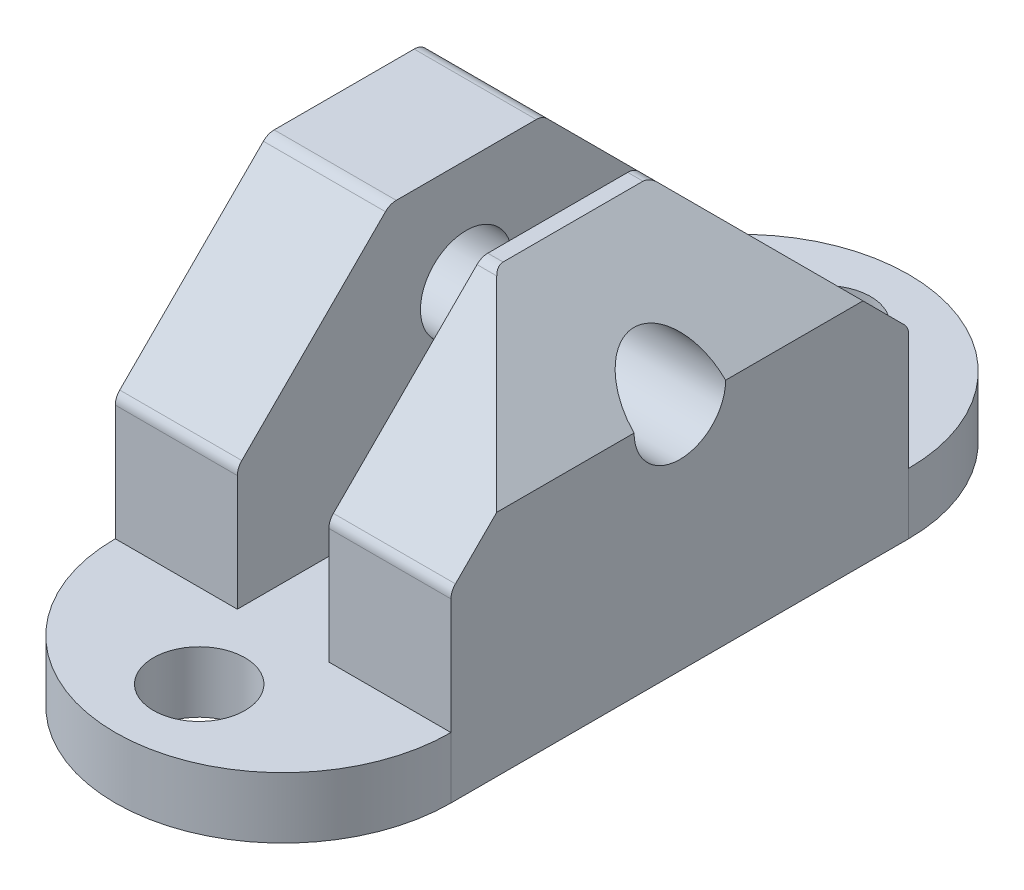
ISO-10303-21;
HEADER;
FILE_DESCRIPTION(('STEP AP214'),'2;1');
FILE_NAME('part.step','',(''),(''),'','','');
FILE_SCHEMA(('AUTOMOTIVE_DESIGN { 1 0 10303 214 1 1 1 1 }'));
ENDSEC;
DATA;
#1=APPLICATION_CONTEXT('core data for automotive mechanical design processes');
#2=APPLICATION_PROTOCOL_DEFINITION('international standard','automotive_design',2000,#1);
#3=PRODUCT_CONTEXT('',#1,'mechanical');
#4=PRODUCT('Part','Part','',(#3));
#5=PRODUCT_RELATED_PRODUCT_CATEGORY('part','',(#4));
#6=PRODUCT_DEFINITION_FORMATION('','',#4);
#7=PRODUCT_DEFINITION_CONTEXT('part definition',#1,'design');
#8=PRODUCT_DEFINITION('design','',#6,#7);
#9=PRODUCT_DEFINITION_SHAPE('','',#8);
#10=(LENGTH_UNIT() NAMED_UNIT(*) SI_UNIT(.MILLI.,.METRE.));
#11=(NAMED_UNIT(*) PLANE_ANGLE_UNIT() SI_UNIT($,.RADIAN.));
#12=(NAMED_UNIT(*) SI_UNIT($,.STERADIAN.) SOLID_ANGLE_UNIT());
#13=UNCERTAINTY_MEASURE_WITH_UNIT(LENGTH_MEASURE(1.E-05),#10,'distance_accuracy_value','');
#14=(GEOMETRIC_REPRESENTATION_CONTEXT(3) GLOBAL_UNCERTAINTY_ASSIGNED_CONTEXT((#13)) GLOBAL_UNIT_ASSIGNED_CONTEXT((#10,
#11,#12)) REPRESENTATION_CONTEXT('',''));
#15=CARTESIAN_POINT('',(0.,0.,0.));
#16=DIRECTION('',(0.,0.,1.));
#17=DIRECTION('',(1.,0.,0.));
#18=AXIS2_PLACEMENT_3D('',#15,#16,#17);
#19=CARTESIAN_POINT('',(-5.5,0.,-7.50000011175871));
#20=DIRECTION('',(0.,1.,0.));
#21=DIRECTION('',(1.,0.,0.));
#22=AXIS2_PLACEMENT_3D('',#19,#20,#21);
#23=PLANE('',#22);
#24=CARTESIAN_POINT('',(-5.5,0.,-17.7500002235174));
#25=DIRECTION('',(0.,1.,0.));
#26=DIRECTION('',(-1.,0.,0.));
#27=AXIS2_PLACEMENT_3D('',#24,#25,#26);
#28=CIRCLE('',#27,1.5);
#29=CARTESIAN_POINT('',(-4.,0.,-17.7500002235174));
#30=VERTEX_POINT('',#29);
#31=EDGE_CURVE('E309',#30,#30,#28,.T.);
#32=ORIENTED_EDGE('',*,*,#31,.T.);
#33=EDGE_LOOP('',(#32));
#34=FACE_BOUND('',#33,.T.);
#35=CARTESIAN_POINT('',(-5.5,0.,2.75000004097819));
#36=DIRECTION('',(0.,1.,0.));
#37=DIRECTION('',(-1.,0.,0.));
#38=AXIS2_PLACEMENT_3D('',#35,#36,#37);
#39=CIRCLE('',#38,1.5);
#40=CARTESIAN_POINT('',(-4.,0.,2.75000004097819));
#41=VERTEX_POINT('',#40);
#42=EDGE_CURVE('E228',#41,#41,#39,.T.);
#43=ORIENTED_EDGE('',*,*,#42,.T.);
#44=EDGE_LOOP('',(#43));
#45=FACE_BOUND('',#44,.T.);
#46=DIRECTION('',(0.,0.,1.));
#47=VECTOR('',#46,1.);
#48=CARTESIAN_POINT('',(0.,0.,-15.0000002235174));
#49=LINE('',#48,#47);
#50=CARTESIAN_POINT('',(0.,0.,-15.0000002235174));
#51=VERTEX_POINT('',#50);
#52=CARTESIAN_POINT('',(0.,0.,0.));
#53=VERTEX_POINT('',#52);
#54=EDGE_CURVE('E286',#51,#53,#49,.T.);
#55=ORIENTED_EDGE('',*,*,#54,.T.);
#56=CARTESIAN_POINT('',(-5.5,0.,0.));
#57=DIRECTION('',(0.,-1.,0.));
#58=DIRECTION('',(1.,0.,0.));
#59=AXIS2_PLACEMENT_3D('',#56,#57,#58);
#60=CIRCLE('',#59,5.50000008195639);
#61=CARTESIAN_POINT('',(-11.,0.,0.));
#62=VERTEX_POINT('',#61);
#63=EDGE_CURVE('E394',#53,#62,#60,.T.);
#64=ORIENTED_EDGE('',*,*,#63,.T.);
#65=DIRECTION('',(0.,0.,-1.));
#66=VECTOR('',#65,1.);
#67=CARTESIAN_POINT('',(-11.,0.,0.));
#68=LINE('',#67,#66);
#69=CARTESIAN_POINT('',(-11.,0.,-15.0000002235174));
#70=VERTEX_POINT('',#69);
#71=EDGE_CURVE('E385',#62,#70,#68,.T.);
#72=ORIENTED_EDGE('',*,*,#71,.T.);
#73=CARTESIAN_POINT('',(-5.5,0.,-15.0000002235174));
#74=DIRECTION('',(0.,-1.,0.));
#75=DIRECTION('',(1.,0.,0.));
#76=AXIS2_PLACEMENT_3D('',#73,#74,#75);
#77=CIRCLE('',#76,5.50000008195639);
#78=EDGE_CURVE('E308',#70,#51,#77,.T.);
#79=ORIENTED_EDGE('',*,*,#78,.T.);
#80=EDGE_LOOP('',(#55,#64,#72,#79));
#81=FACE_BOUND('',#80,.T.);
#82=ADVANCED_FACE('F40',(#34,#45,#81),#23,.F.);
#83=CARTESIAN_POINT('',(-5.5,2.,-7.50000011175871));
#84=DIRECTION('',(0.,1.,0.));
#85=DIRECTION('',(1.,0.,0.));
#86=AXIS2_PLACEMENT_3D('',#83,#84,#85);
#87=PLANE('',#86);
#88=CARTESIAN_POINT('',(-5.5,2.,-17.7500002235174));
#89=DIRECTION('',(0.,-1.,0.));
#90=DIRECTION('',(-1.,0.,0.));
#91=AXIS2_PLACEMENT_3D('',#88,#89,#90);
#92=CIRCLE('',#91,1.5);
#93=CARTESIAN_POINT('',(-4.,2.,-17.7500002235174));
#94=VERTEX_POINT('',#93);
#95=EDGE_CURVE('E356',#94,#94,#92,.T.);
#96=ORIENTED_EDGE('',*,*,#95,.T.);
#97=EDGE_LOOP('',(#96));
#98=FACE_BOUND('',#97,.T.);
#99=CARTESIAN_POINT('',(-5.5,2.,2.75000004097819));
#100=DIRECTION('',(0.,-1.,0.));
#101=DIRECTION('',(-1.,0.,0.));
#102=AXIS2_PLACEMENT_3D('',#99,#100,#101);
#103=CIRCLE('',#102,1.5);
#104=CARTESIAN_POINT('',(-4.,2.,2.75000004097819));
#105=VERTEX_POINT('',#104);
#106=EDGE_CURVE('E227',#105,#105,#103,.T.);
#107=ORIENTED_EDGE('',*,*,#106,.T.);
#108=EDGE_LOOP('',(#107));
#109=FACE_BOUND('',#108,.T.);
#110=DIRECTION('',(0.,0.,1.));
#111=VECTOR('',#110,1.);
#112=CARTESIAN_POINT('',(-7.00000010430813,2.,-3.75000005587935));
#113=LINE('',#112,#111);
#114=CARTESIAN_POINT('',(-7.00000010430813,2.,-15.0000002235174));
#115=VERTEX_POINT('',#114);
#116=CARTESIAN_POINT('',(-7.00000010430813,2.,0.));
#117=VERTEX_POINT('',#116);
#118=EDGE_CURVE('E287',#115,#117,#113,.T.);
#119=ORIENTED_EDGE('',*,*,#118,.T.);
#120=DIRECTION('',(1.,0.,0.));
#121=VECTOR('',#120,1.);
#122=CARTESIAN_POINT('',(-8.25,2.,0.));
#123=LINE('',#122,#121);
#124=CARTESIAN_POINT('',(-11.0000000819564,2.,0.));
#125=VERTEX_POINT('',#124);
#126=EDGE_CURVE('E279',#125,#117,#123,.T.);
#127=ORIENTED_EDGE('',*,*,#126,.F.);
#128=CARTESIAN_POINT('',(-5.5,2.,0.));
#129=DIRECTION('',(0.,1.,0.));
#130=DIRECTION('',(1.,0.,0.));
#131=AXIS2_PLACEMENT_3D('',#128,#129,#130);
#132=CIRCLE('',#131,5.50000008195639);
#133=CARTESIAN_POINT('',(0.,2.,0.));
#134=VERTEX_POINT('',#133);
#135=EDGE_CURVE('E395',#125,#134,#132,.T.);
#136=ORIENTED_EDGE('',*,*,#135,.T.);
#137=DIRECTION('',(1.,0.,0.));
#138=VECTOR('',#137,1.);
#139=CARTESIAN_POINT('',(-8.25,2.,0.));
#140=LINE('',#139,#138);
#141=CARTESIAN_POINT('',(-3.99999989569187,2.,0.));
#142=VERTEX_POINT('',#141);
#143=EDGE_CURVE('E285',#142,#134,#140,.T.);
#144=ORIENTED_EDGE('',*,*,#143,.F.);
#145=DIRECTION('',(0.,0.,-1.));
#146=VECTOR('',#145,1.);
#147=CARTESIAN_POINT('',(-3.99999989569187,2.,-11.2500001676381));
#148=LINE('',#147,#146);
#149=CARTESIAN_POINT('',(-3.99999989569187,2.,-15.0000002235174));
#150=VERTEX_POINT('',#149);
#151=EDGE_CURVE('E341',#142,#150,#148,.T.);
#152=ORIENTED_EDGE('',*,*,#151,.T.);
#153=DIRECTION('',(-1.,0.,0.));
#154=VECTOR('',#153,1.);
#155=CARTESIAN_POINT('',(-2.75,2.,-15.0000002235174));
#156=LINE('',#155,#154);
#157=CARTESIAN_POINT('',(0.,2.,-15.0000002235174));
#158=VERTEX_POINT('',#157);
#159=EDGE_CURVE('E243',#158,#150,#156,.T.);
#160=ORIENTED_EDGE('',*,*,#159,.F.);
#161=CARTESIAN_POINT('',(-5.5,2.,-15.0000002235174));
#162=DIRECTION('',(0.,1.,0.));
#163=DIRECTION('',(1.,0.,0.));
#164=AXIS2_PLACEMENT_3D('',#161,#162,#163);
#165=CIRCLE('',#164,5.50000008195639);
#166=CARTESIAN_POINT('',(-11.0000000819564,2.,-15.0000002235174));
#167=VERTEX_POINT('',#166);
#168=EDGE_CURVE('E336',#158,#167,#165,.T.);
#169=ORIENTED_EDGE('',*,*,#168,.T.);
#170=DIRECTION('',(-1.,0.,0.));
#171=VECTOR('',#170,1.);
#172=CARTESIAN_POINT('',(-2.75,2.,-15.0000002235174));
#173=LINE('',#172,#171);
#174=EDGE_CURVE('E404',#115,#167,#173,.T.);
#175=ORIENTED_EDGE('',*,*,#174,.F.);
#176=EDGE_LOOP('',(#119,#127,#136,#144,#152,#160,#169,#175));
#177=FACE_BOUND('',#176,.T.);
#178=ADVANCED_FACE('F231',(#98,#109,#177),#87,.T.);
#179=CARTESIAN_POINT('',(-0.999999973922968,8.5,-12.5000002235174));
#180=DIRECTION('',(0.,0.707106781186548,-0.707106781186548));
#181=DIRECTION('',(-1.,0.,0.));
#182=AXIS2_PLACEMENT_3D('',#179,#180,#181);
#183=PLANE('',#182);
#184=DIRECTION('',(-1.,0.,0.));
#185=VECTOR('',#184,1.);
#186=CARTESIAN_POINT('',(-1.49999996088445,10.8535533905933,-10.1464468329241));
#187=LINE('',#186,#185);
#188=CARTESIAN_POINT('',(-3.35355339059336,10.8535533905933,-10.1464468329241));
#189=VERTEX_POINT('',#188);
#190=CARTESIAN_POINT('',(-3.99999989569187,10.8535533905933,-10.1464468329241));
#191=VERTEX_POINT('',#190);
#192=EDGE_CURVE('E261',#189,#191,#187,.T.);
#193=ORIENTED_EDGE('',*,*,#192,.F.);
#194=DIRECTION('',(-0.57735026918963,0.577350269189624,0.577350269189624));
#195=VECTOR('',#194,1.);
#196=CARTESIAN_POINT('',(-0.99999999130768,8.49999999130764,-12.5000002322098));
#197=LINE('',#196,#195);
#198=CARTESIAN_POINT('',(0.,7.49999999999997,-13.5000002235175));
#199=VERTEX_POINT('',#198);
#200=EDGE_CURVE('E431',#189,#199,#197,.F.);
#201=ORIENTED_EDGE('',*,*,#200,.T.);
#202=DIRECTION('',(0.,-0.707106781186548,-0.707106781186548));
#203=VECTOR('',#202,1.);
#204=CARTESIAN_POINT('',(0.,9.50000005587935,-11.5000001676381));
#205=LINE('',#204,#203);
#206=CARTESIAN_POINT('',(0.,6.14644660940673,-14.8535536141107));
#207=VERTEX_POINT('',#206);
#208=EDGE_CURVE('E275',#199,#207,#205,.T.);
#209=ORIENTED_EDGE('',*,*,#208,.T.);
#210=DIRECTION('',(1.,0.,0.));
#211=VECTOR('',#210,1.);
#212=CARTESIAN_POINT('',(-0.499999986961484,6.14644660940673,-14.8535536141107));
#213=LINE('',#212,#211);
#214=CARTESIAN_POINT('',(-3.99999989569187,6.14644660940673,-14.8535536141107));
#215=VERTEX_POINT('',#214);
#216=EDGE_CURVE('E344',#215,#207,#213,.T.);
#217=ORIENTED_EDGE('',*,*,#216,.F.);
#218=DIRECTION('',(0.,0.707106781186548,0.707106781186548));
#219=VECTOR('',#218,1.);
#220=CARTESIAN_POINT('',(-3.99999989569187,6.25,-14.7500002235174));
#221=LINE('',#220,#219);
#222=EDGE_CURVE('E300',#215,#191,#221,.T.);
#223=ORIENTED_EDGE('',*,*,#222,.T.);
#224=EDGE_LOOP('',(#193,#201,#209,#217,#223));
#225=FACE_BOUND('',#224,.T.);
#226=ADVANCED_FACE('F505',(#225),#183,.T.);
#227=CARTESIAN_POINT('',(-4.50000002607703,8.5,-12.5000002235174));
#228=DIRECTION('',(0.,0.707106781186548,-0.707106781186548));
#229=DIRECTION('',(-1.,0.,0.));
#230=AXIS2_PLACEMENT_3D('',#227,#228,#229);
#231=PLANE('',#230);
#232=DIRECTION('',(1.,0.,0.));
#233=VECTOR('',#232,1.);
#234=CARTESIAN_POINT('',(-2.25000001303852,6.14644660940673,-14.8535536141107));
#235=LINE('',#234,#233);
#236=CARTESIAN_POINT('',(-11.,6.14644660940673,-14.8535536141107));
#237=VERTEX_POINT('',#236);
#238=CARTESIAN_POINT('',(-7.00000010430813,6.14644660940673,-14.8535536141107));
#239=VERTEX_POINT('',#238);
#240=EDGE_CURVE('E255',#237,#239,#235,.T.);
#241=ORIENTED_EDGE('',*,*,#240,.F.);
#242=DIRECTION('',(0.,0.707106781186548,0.707106781186548));
#243=VECTOR('',#242,1.);
#244=CARTESIAN_POINT('',(-11.,5.75,-15.2500002235174));
#245=LINE('',#244,#243);
#246=CARTESIAN_POINT('',(-11.,10.8535533905933,-10.1464468329241));
#247=VERTEX_POINT('',#246);
#248=EDGE_CURVE('E271',#237,#247,#245,.T.);
#249=ORIENTED_EDGE('',*,*,#248,.T.);
#250=DIRECTION('',(-1.,0.,0.));
#251=VECTOR('',#250,1.);
#252=CARTESIAN_POINT('',(-6.75000003911555,10.8535533905933,-10.1464468329241));
#253=LINE('',#252,#251);
#254=CARTESIAN_POINT('',(-7.00000010430813,10.8535533905933,-10.1464468329241));
#255=VERTEX_POINT('',#254);
#256=EDGE_CURVE('E329',#255,#247,#253,.T.);
#257=ORIENTED_EDGE('',*,*,#256,.F.);
#258=DIRECTION('',(0.,-0.707106781186548,-0.707106781186548));
#259=VECTOR('',#258,1.);
#260=CARTESIAN_POINT('',(-7.00000010430813,10.0000000558794,-11.0000001676381));
#261=LINE('',#260,#259);
#262=EDGE_CURVE('E408',#255,#239,#261,.T.);
#263=ORIENTED_EDGE('',*,*,#262,.T.);
#264=EDGE_LOOP('',(#241,#249,#257,#263));
#265=FACE_BOUND('',#264,.T.);
#266=ADVANCED_FACE('F521',(#265),#231,.T.);
#267=CARTESIAN_POINT('',(0.,7.50000002980232,-7.50000011175871));
#268=DIRECTION('',(-1.,0.,0.));
#269=DIRECTION('',(0.,0.,-1.));
#270=AXIS2_PLACEMENT_3D('',#267,#268,#269);
#271=CYLINDRICAL_SURFACE('',#270,1.5);
#272=CARTESIAN_POINT('',(0.,7.50000002980232,-7.50000011175871));
#273=DIRECTION('',(-1.,0.,0.));
#274=DIRECTION('',(0.,0.,-1.));
#275=AXIS2_PLACEMENT_3D('',#272,#273,#274);
#276=CIRCLE('',#275,1.5);
#277=CARTESIAN_POINT('',(0.,7.49999999999997,-9.00000011175871));
#278=VERTEX_POINT('',#277);
#279=CARTESIAN_POINT('',(0.,7.50000002980232,-6.00000011175871));
#280=VERTEX_POINT('',#279);
#281=EDGE_CURVE('E283',#278,#280,#276,.T.);
#282=ORIENTED_EDGE('',*,*,#281,.F.);
#283=CARTESIAN_POINT('',(-2.98023450806731E-08,7.50000002980232,-7.50000011175871));
#284=DIRECTION('',(-0.707106781186544,-0.707106781186551,0.));
#285=DIRECTION('',(-0.707106781186551,0.707106781186544,0.));
#286=AXIS2_PLACEMENT_3D('',#283,#284,#285);
#287=ELLIPSE('',#286,2.12132034355965,1.5);
#288=EDGE_CURVE('E436',#278,#280,#287,.F.);
#289=ORIENTED_EDGE('',*,*,#288,.T.);
#290=DIRECTION('',(-1.,0.,0.));
#291=VECTOR('',#290,1.);
#292=CARTESIAN_POINT('',(0.,7.50000002980232,-6.00000011175871));
#293=LINE('',#292,#291);
#294=CARTESIAN_POINT('',(-3.99999989569187,7.50000002980232,-6.00000011175871));
#295=VERTEX_POINT('',#294);
#296=EDGE_CURVE('E293',#280,#295,#293,.T.);
#297=ORIENTED_EDGE('',*,*,#296,.T.);
#298=CARTESIAN_POINT('',(-3.99999989569187,7.50000002980232,-7.50000011175871));
#299=DIRECTION('',(1.,0.,0.));
#300=DIRECTION('',(0.,0.,-1.));
#301=AXIS2_PLACEMENT_3D('',#298,#299,#300);
#302=CIRCLE('',#301,1.5);
#303=EDGE_CURVE('E303',#295,#295,#302,.T.);
#304=ORIENTED_EDGE('',*,*,#303,.F.);
#305=ORIENTED_EDGE('',*,*,#296,.F.);
#306=EDGE_LOOP('',(#282,#289,#297,#304,#305));
#307=FACE_BOUND('',#306,.T.);
#308=ADVANCED_FACE('F440',(#307),#271,.F.);
#309=CARTESIAN_POINT('',(0.,7.50000002980232,-7.50000011175871));
#310=DIRECTION('',(-1.,0.,0.));
#311=DIRECTION('',(0.,0.,-1.));
#312=AXIS2_PLACEMENT_3D('',#309,#310,#311);
#313=CYLINDRICAL_SURFACE('',#312,1.5);
#314=CARTESIAN_POINT('',(-7.00000010430813,7.50000002980232,-7.50000011175871));
#315=DIRECTION('',(-1.,0.,0.));
#316=DIRECTION('',(0.,0.,-1.));
#317=AXIS2_PLACEMENT_3D('',#314,#315,#316);
#318=CIRCLE('',#317,1.5);
#319=CARTESIAN_POINT('',(-7.00000010430813,7.50000002980232,-6.00000011175871));
#320=VERTEX_POINT('',#319);
#321=EDGE_CURVE('E289',#320,#320,#318,.T.);
#322=ORIENTED_EDGE('',*,*,#321,.F.);
#323=DIRECTION('',(-1.,0.,0.));
#324=VECTOR('',#323,1.);
#325=CARTESIAN_POINT('',(0.,7.50000002980232,-6.00000011175871));
#326=LINE('',#325,#324);
#327=CARTESIAN_POINT('',(-11.,7.50000002980232,-6.00000011175871));
#328=VERTEX_POINT('',#327);
#329=EDGE_CURVE('E291',#320,#328,#326,.T.);
#330=ORIENTED_EDGE('',*,*,#329,.T.);
#331=CARTESIAN_POINT('',(-11.,7.50000002980232,-7.50000011175871));
#332=DIRECTION('',(1.,0.,0.));
#333=DIRECTION('',(0.,0.,-1.));
#334=AXIS2_PLACEMENT_3D('',#331,#332,#333);
#335=CIRCLE('',#334,1.5);
#336=EDGE_CURVE('E378',#328,#328,#335,.T.);
#337=ORIENTED_EDGE('',*,*,#336,.F.);
#338=ORIENTED_EDGE('',*,*,#329,.F.);
#339=EDGE_LOOP('',(#322,#330,#337,#338));
#340=FACE_BOUND('',#339,.T.);
#341=ADVANCED_FACE('F512',(#340),#313,.F.);
#342=CARTESIAN_POINT('',(-8.74999998696149,5.79289321881345,-0.5));
#343=DIRECTION('',(1.,0.,0.));
#344=DIRECTION('',(0.,0.382683432365089,0.923879532511287));
#345=AXIS2_PLACEMENT_3D('',#342,#343,#344);
#346=CYLINDRICAL_SURFACE('',#345,0.5);
#347=CARTESIAN_POINT('',(0.,5.79289321881345,-0.5));
#348=DIRECTION('',(-1.,0.,0.));
#349=DIRECTION('',(0.,0.382683432365089,0.923879532511287));
#350=AXIS2_PLACEMENT_3D('',#347,#348,#349);
#351=CIRCLE('',#350,0.5);
#352=CARTESIAN_POINT('',(0.,5.79289321881345,0.));
#353=VERTEX_POINT('',#352);
#354=CARTESIAN_POINT('',(0.,6.14644660940673,-0.146446609406726));
#355=VERTEX_POINT('',#354);
#356=EDGE_CURVE('E274',#353,#355,#351,.T.);
#357=ORIENTED_EDGE('',*,*,#356,.T.);
#358=DIRECTION('',(-1.,0.,0.));
#359=VECTOR('',#358,1.);
#360=CARTESIAN_POINT('',(-8.74999998696149,6.14644660940673,-0.146446609406726));
#361=LINE('',#360,#359);
#362=CARTESIAN_POINT('',(-3.99999989569187,6.14644660940673,-0.146446609406727));
#363=VERTEX_POINT('',#362);
#364=EDGE_CURVE('E382',#355,#363,#361,.T.);
#365=ORIENTED_EDGE('',*,*,#364,.T.);
#366=CARTESIAN_POINT('',(-3.99999989569187,5.79289321881345,-0.5));
#367=DIRECTION('',(1.,0.,0.));
#368=DIRECTION('',(0.,0.382683432365089,0.923879532511287));
#369=AXIS2_PLACEMENT_3D('',#366,#367,#368);
#370=CIRCLE('',#369,0.5);
#371=CARTESIAN_POINT('',(-3.99999989569187,5.79289321881345,0.));
#372=VERTEX_POINT('',#371);
#373=EDGE_CURVE('E343',#363,#372,#370,.T.);
#374=ORIENTED_EDGE('',*,*,#373,.T.);
#375=DIRECTION('',(1.,0.,0.));
#376=VECTOR('',#375,1.);
#377=CARTESIAN_POINT('',(-8.74999998696149,5.79289321881345,0.));
#378=LINE('',#377,#376);
#379=EDGE_CURVE('E380',#372,#353,#378,.T.);
#380=ORIENTED_EDGE('',*,*,#379,.T.);
#381=EDGE_LOOP('',(#357,#365,#374,#380));
#382=FACE_BOUND('',#381,.T.);
#383=ADVANCED_FACE('F466',(#382),#346,.T.);
#384=CARTESIAN_POINT('',(-10.5000000130385,5.79289321881345,-0.5));
#385=DIRECTION('',(1.,0.,0.));
#386=DIRECTION('',(0.,0.382683432365089,0.923879532511287));
#387=AXIS2_PLACEMENT_3D('',#384,#385,#386);
#388=CYLINDRICAL_SURFACE('',#387,0.5);
#389=CARTESIAN_POINT('',(-11.,5.79289321881345,-0.5));
#390=DIRECTION('',(1.,0.,0.));
#391=DIRECTION('',(0.,0.382683432365089,0.923879532511287));
#392=AXIS2_PLACEMENT_3D('',#389,#390,#391);
#393=CIRCLE('',#392,0.5);
#394=CARTESIAN_POINT('',(-11.,6.14644660940673,-0.146446609406728));
#395=VERTEX_POINT('',#394);
#396=CARTESIAN_POINT('',(-11.,5.79289321881345,0.));
#397=VERTEX_POINT('',#396);
#398=EDGE_CURVE('E314',#395,#397,#393,.T.);
#399=ORIENTED_EDGE('',*,*,#398,.T.);
#400=DIRECTION('',(1.,0.,0.));
#401=VECTOR('',#400,1.);
#402=CARTESIAN_POINT('',(-10.5000000130385,5.79289321881345,0.));
#403=LINE('',#402,#401);
#404=CARTESIAN_POINT('',(-7.00000010430813,5.79289321881345,0.));
#405=VERTEX_POINT('',#404);
#406=EDGE_CURVE('E247',#397,#405,#403,.T.);
#407=ORIENTED_EDGE('',*,*,#406,.T.);
#408=CARTESIAN_POINT('',(-7.00000010430813,5.79289321881345,-0.5));
#409=DIRECTION('',(-1.,0.,0.));
#410=DIRECTION('',(0.,0.382683432365089,0.923879532511287));
#411=AXIS2_PLACEMENT_3D('',#408,#409,#410);
#412=CIRCLE('',#411,0.5);
#413=CARTESIAN_POINT('',(-7.00000010430813,6.14644660940673,-0.146446609406727));
#414=VERTEX_POINT('',#413);
#415=EDGE_CURVE('E290',#405,#414,#412,.T.);
#416=ORIENTED_EDGE('',*,*,#415,.T.);
#417=DIRECTION('',(-1.,0.,0.));
#418=VECTOR('',#417,1.);
#419=CARTESIAN_POINT('',(-10.5000000130385,6.14644660940673,-0.146446609406726));
#420=LINE('',#419,#418);
#421=EDGE_CURVE('E294',#414,#395,#420,.T.);
#422=ORIENTED_EDGE('',*,*,#421,.T.);
#423=EDGE_LOOP('',(#399,#407,#416,#422));
#424=FACE_BOUND('',#423,.T.);
#425=ADVANCED_FACE('F519',(#424),#388,.T.);
#426=CARTESIAN_POINT('',(-10.000000026077,8.5,-2.5));
#427=DIRECTION('',(0.,0.707106781186548,0.707106781186548));
#428=DIRECTION('',(1.,0.,0.));
#429=AXIS2_PLACEMENT_3D('',#426,#427,#428);
#430=PLANE('',#429);
#431=DIRECTION('',(1.,0.,0.));
#432=VECTOR('',#431,1.);
#433=CARTESIAN_POINT('',(-9.50000003911555,10.8535533905933,-4.85355339059327));
#434=LINE('',#433,#432);
#435=CARTESIAN_POINT('',(-11.,10.8535533905933,-4.85355339059327));
#436=VERTEX_POINT('',#435);
#437=CARTESIAN_POINT('',(-7.00000010430813,10.8535533905933,-4.85355339059327));
#438=VERTEX_POINT('',#437);
#439=EDGE_CURVE('E384',#436,#438,#434,.T.);
#440=ORIENTED_EDGE('',*,*,#439,.F.);
#441=DIRECTION('',(0.,-0.707106781186548,0.707106781186548));
#442=VECTOR('',#441,1.);
#443=CARTESIAN_POINT('',(-11.,9.50000005587935,-3.50000005587936));
#444=LINE('',#443,#442);
#445=EDGE_CURVE('E266',#436,#395,#444,.T.);
#446=ORIENTED_EDGE('',*,*,#445,.T.);
#447=ORIENTED_EDGE('',*,*,#421,.F.);
#448=DIRECTION('',(0.,0.707106781186548,-0.707106781186548));
#449=VECTOR('',#448,1.);
#450=CARTESIAN_POINT('',(-7.00000010430813,6.25,-0.25));
#451=LINE('',#450,#449);
#452=EDGE_CURVE('E323',#414,#438,#451,.T.);
#453=ORIENTED_EDGE('',*,*,#452,.T.);
#454=EDGE_LOOP('',(#440,#446,#447,#453));
#455=FACE_BOUND('',#454,.T.);
#456=ADVANCED_FACE('F551',(#455),#430,.T.);
#457=CARTESIAN_POINT('',(-9.50000003911555,10.5,-5.20710678118655));
#458=DIRECTION('',(-1.,0.,0.));
#459=DIRECTION('',(0.,0.923879532511287,0.382683432365088));
#460=AXIS2_PLACEMENT_3D('',#457,#458,#459);
#461=CYLINDRICAL_SURFACE('',#460,0.5);
#462=CARTESIAN_POINT('',(-11.,10.5,-5.20710678118655));
#463=DIRECTION('',(1.,0.,0.));
#464=DIRECTION('',(0.,0.923879532511287,0.382683432365088));
#465=AXIS2_PLACEMENT_3D('',#462,#463,#464);
#466=CIRCLE('',#465,0.5);
#467=CARTESIAN_POINT('',(-11.,11.,-5.20710678118655));
#468=VERTEX_POINT('',#467);
#469=EDGE_CURVE('E242',#468,#436,#466,.T.);
#470=ORIENTED_EDGE('',*,*,#469,.T.);
#471=ORIENTED_EDGE('',*,*,#439,.T.);
#472=CARTESIAN_POINT('',(-7.00000010430813,10.5,-5.20710678118655));
#473=DIRECTION('',(-1.,0.,0.));
#474=DIRECTION('',(0.,0.923879532511287,0.382683432365088));
#475=AXIS2_PLACEMENT_3D('',#472,#473,#474);
#476=CIRCLE('',#475,0.5);
#477=CARTESIAN_POINT('',(-7.00000010430813,11.,-5.20710678118655));
#478=VERTEX_POINT('',#477);
#479=EDGE_CURVE('E320',#438,#478,#476,.T.);
#480=ORIENTED_EDGE('',*,*,#479,.T.);
#481=DIRECTION('',(-1.,0.,0.));
#482=VECTOR('',#481,1.);
#483=CARTESIAN_POINT('',(-9.50000003911555,11.,-5.20710678118655));
#484=LINE('',#483,#482);
#485=EDGE_CURVE('E280',#478,#468,#484,.T.);
#486=ORIENTED_EDGE('',*,*,#485,.T.);
#487=EDGE_LOOP('',(#470,#471,#480,#486));
#488=FACE_BOUND('',#487,.T.);
#489=ADVANCED_FACE('F511',(#488),#461,.T.);
#490=CARTESIAN_POINT('',(-6.49999997392297,8.5,-2.5));
#491=DIRECTION('',(0.,0.707106781186548,0.707106781186548));
#492=DIRECTION('',(1.,0.,0.));
#493=AXIS2_PLACEMENT_3D('',#490,#491,#492);
#494=PLANE('',#493);
#495=DIRECTION('',(0.,0.707106781186548,-0.707106781186548));
#496=VECTOR('',#495,1.);
#497=CARTESIAN_POINT('',(0.,5.75,0.25));
#498=LINE('',#497,#496);
#499=CARTESIAN_POINT('',(0.,7.49999999999998,-1.49999999999998));
#500=VERTEX_POINT('',#499);
#501=EDGE_CURVE('E272',#355,#500,#498,.T.);
#502=ORIENTED_EDGE('',*,*,#501,.T.);
#503=DIRECTION('',(0.57735026918963,-0.577350269189624,0.577350269189624));
#504=VECTOR('',#503,1.);
#505=CARTESIAN_POINT('',(-2.83333332464104,10.333333324641,-4.33333332464098));
#506=LINE('',#505,#504);
#507=CARTESIAN_POINT('',(-3.35355339059336,10.8535533905933,-4.85355339059327));
#508=VERTEX_POINT('',#507);
#509=EDGE_CURVE('E49',#500,#508,#506,.F.);
#510=ORIENTED_EDGE('',*,*,#509,.T.);
#511=DIRECTION('',(1.,0.,0.));
#512=VECTOR('',#511,1.);
#513=CARTESIAN_POINT('',(-4.24999996088445,10.8535533905933,-4.85355339059327));
#514=LINE('',#513,#512);
#515=CARTESIAN_POINT('',(-3.99999989569187,10.8535533905933,-4.85355339059327));
#516=VERTEX_POINT('',#515);
#517=EDGE_CURVE('E263',#516,#508,#514,.T.);
#518=ORIENTED_EDGE('',*,*,#517,.F.);
#519=DIRECTION('',(0.,-0.707106781186548,0.707106781186548));
#520=VECTOR('',#519,1.);
#521=CARTESIAN_POINT('',(-3.99999989569187,10.0000000558794,-4.00000005587936));
#522=LINE('',#521,#520);
#523=EDGE_CURVE('E299',#516,#363,#522,.T.);
#524=ORIENTED_EDGE('',*,*,#523,.T.);
#525=ORIENTED_EDGE('',*,*,#364,.F.);
#526=EDGE_LOOP('',(#502,#510,#518,#524,#525));
#527=FACE_BOUND('',#526,.T.);
#528=ADVANCED_FACE('F463',(#527),#494,.T.);
#529=CARTESIAN_POINT('',(-4.24999996088445,10.5,-5.20710678118655));
#530=DIRECTION('',(-1.,0.,0.));
#531=DIRECTION('',(0.,0.923879532511287,0.382683432365088));
#532=AXIS2_PLACEMENT_3D('',#529,#530,#531);
#533=CYLINDRICAL_SURFACE('',#532,0.5);
#534=ORIENTED_EDGE('',*,*,#517,.T.);
#535=CARTESIAN_POINT('',(-3.00000000000006,10.5,-5.20710678118655));
#536=DIRECTION('',(-0.707106781186544,-0.707106781186551,0.));
#537=DIRECTION('',(-0.707106781186551,0.707106781186544,0.));
#538=AXIS2_PLACEMENT_3D('',#535,#536,#537);
#539=ELLIPSE('',#538,0.707106781186551,0.5);
#540=CARTESIAN_POINT('',(-3.50000000000006,11.,-5.20710678118655));
#541=VERTEX_POINT('',#540);
#542=EDGE_CURVE('E11',#508,#541,#539,.T.);
#543=ORIENTED_EDGE('',*,*,#542,.T.);
#544=DIRECTION('',(-1.,0.,0.));
#545=VECTOR('',#544,1.);
#546=CARTESIAN_POINT('',(-4.24999996088445,11.,-5.20710678118655));
#547=LINE('',#546,#545);
#548=CARTESIAN_POINT('',(-3.99999989569187,11.,-5.20710678118655));
#549=VERTEX_POINT('',#548);
#550=EDGE_CURVE('E260',#541,#549,#547,.T.);
#551=ORIENTED_EDGE('',*,*,#550,.T.);
#552=CARTESIAN_POINT('',(-3.99999989569187,10.5,-5.20710678118655));
#553=DIRECTION('',(1.,0.,0.));
#554=DIRECTION('',(0.,0.923879532511287,0.382683432365088));
#555=AXIS2_PLACEMENT_3D('',#552,#553,#554);
#556=CIRCLE('',#555,0.5);
#557=EDGE_CURVE('E295',#549,#516,#556,.T.);
#558=ORIENTED_EDGE('',*,*,#557,.T.);
#559=EDGE_LOOP('',(#534,#543,#551,#558));
#560=FACE_BOUND('',#559,.T.);
#561=ADVANCED_FACE('F452',(#560),#533,.T.);
#562=CARTESIAN_POINT('',(-1.99999994784594,11.,-7.50000011175871));
#563=DIRECTION('',(0.,1.,0.));
#564=DIRECTION('',(1.,0.,0.));
#565=AXIS2_PLACEMENT_3D('',#562,#563,#564);
#566=PLANE('',#565);
#567=ORIENTED_EDGE('',*,*,#550,.F.);
#568=DIRECTION('',(0.,0.,-1.));
#569=VECTOR('',#568,1.);
#570=CARTESIAN_POINT('',(-3.50000000000006,11.,-7.50000011175871));
#571=LINE('',#570,#569);
#572=CARTESIAN_POINT('',(-3.50000000000006,11.,-9.79289344233087));
#573=VERTEX_POINT('',#572);
#574=EDGE_CURVE('E354',#541,#573,#571,.T.);
#575=ORIENTED_EDGE('',*,*,#574,.T.);
#576=DIRECTION('',(1.,0.,0.));
#577=VECTOR('',#576,1.);
#578=CARTESIAN_POINT('',(-1.49999996088445,11.,-9.79289344233087));
#579=LINE('',#578,#577);
#580=CARTESIAN_POINT('',(-3.99999989569187,11.,-9.79289344233087));
#581=VERTEX_POINT('',#580);
#582=EDGE_CURVE('E257',#581,#573,#579,.T.);
#583=ORIENTED_EDGE('',*,*,#582,.F.);
#584=DIRECTION('',(0.,0.,1.));
#585=VECTOR('',#584,1.);
#586=CARTESIAN_POINT('',(-3.99999989569187,11.,0.));
#587=LINE('',#586,#585);
#588=EDGE_CURVE('E298',#581,#549,#587,.T.);
#589=ORIENTED_EDGE('',*,*,#588,.T.);
#590=EDGE_LOOP('',(#567,#575,#583,#589));
#591=FACE_BOUND('',#590,.T.);
#592=ADVANCED_FACE('F454',(#591),#566,.T.);
#593=CARTESIAN_POINT('',(-1.49999996088445,10.5,-9.79289344233087));
#594=DIRECTION('',(1.,0.,0.));
#595=DIRECTION('',(0.,0.923879532511286,-0.382683432365091));
#596=AXIS2_PLACEMENT_3D('',#593,#594,#595);
#597=CYLINDRICAL_SURFACE('',#596,0.5);
#598=ORIENTED_EDGE('',*,*,#582,.T.);
#599=CARTESIAN_POINT('',(-3.00000000000006,10.5,-9.79289344233087));
#600=DIRECTION('',(-0.707106781186544,-0.707106781186551,0.));
#601=DIRECTION('',(0.707106781186551,-0.707106781186544,0.));
#602=AXIS2_PLACEMENT_3D('',#599,#600,#601);
#603=ELLIPSE('',#602,0.707106781186551,0.5);
#604=EDGE_CURVE('E429',#573,#189,#603,.T.);
#605=ORIENTED_EDGE('',*,*,#604,.T.);
#606=ORIENTED_EDGE('',*,*,#192,.T.);
#607=CARTESIAN_POINT('',(-3.99999989569187,10.5,-9.79289344233087));
#608=DIRECTION('',(1.,0.,0.));
#609=DIRECTION('',(0.,0.923879532511286,-0.382683432365091));
#610=AXIS2_PLACEMENT_3D('',#607,#608,#609);
#611=CIRCLE('',#610,0.5);
#612=EDGE_CURVE('E304',#191,#581,#611,.T.);
#613=ORIENTED_EDGE('',*,*,#612,.T.);
#614=EDGE_LOOP('',(#598,#605,#606,#613));
#615=FACE_BOUND('',#614,.T.);
#616=ADVANCED_FACE('F577',(#615),#597,.T.);
#617=CARTESIAN_POINT('',(-9.00000005215406,11.,-7.50000011175871));
#618=DIRECTION('',(0.,1.,0.));
#619=DIRECTION('',(1.,0.,0.));
#620=AXIS2_PLACEMENT_3D('',#617,#618,#619);
#621=PLANE('',#620);
#622=DIRECTION('',(1.,0.,0.));
#623=VECTOR('',#622,1.);
#624=CARTESIAN_POINT('',(-6.75000003911555,11.,-9.79289344233087));
#625=LINE('',#624,#623);
#626=CARTESIAN_POINT('',(-11.,11.,-9.79289344233087));
#627=VERTEX_POINT('',#626);
#628=CARTESIAN_POINT('',(-7.00000010430813,11.,-9.79289344233087));
#629=VERTEX_POINT('',#628);
#630=EDGE_CURVE('E282',#627,#629,#625,.T.);
#631=ORIENTED_EDGE('',*,*,#630,.F.);
#632=DIRECTION('',(0.,0.,1.));
#633=VECTOR('',#632,1.);
#634=CARTESIAN_POINT('',(-11.,11.,-15.0000002235174));
#635=LINE('',#634,#633);
#636=EDGE_CURVE('E238',#627,#468,#635,.T.);
#637=ORIENTED_EDGE('',*,*,#636,.T.);
#638=ORIENTED_EDGE('',*,*,#485,.F.);
#639=DIRECTION('',(0.,0.,-1.));
#640=VECTOR('',#639,1.);
#641=CARTESIAN_POINT('',(-7.00000010430813,11.,0.));
#642=LINE('',#641,#640);
#643=EDGE_CURVE('E324',#478,#629,#642,.T.);
#644=ORIENTED_EDGE('',*,*,#643,.T.);
#645=EDGE_LOOP('',(#631,#637,#638,#644));
#646=FACE_BOUND('',#645,.T.);
#647=ADVANCED_FACE('F545',(#646),#621,.T.);
#648=CARTESIAN_POINT('',(-6.75000003911555,10.5,-9.79289344233087));
#649=DIRECTION('',(1.,0.,0.));
#650=DIRECTION('',(0.,0.923879532511286,-0.382683432365091));
#651=AXIS2_PLACEMENT_3D('',#648,#649,#650);
#652=CYLINDRICAL_SURFACE('',#651,0.5);
#653=CARTESIAN_POINT('',(-7.00000010430813,10.5,-9.79289344233087));
#654=DIRECTION('',(-1.,0.,0.));
#655=DIRECTION('',(0.,0.923879532511286,-0.382683432365091));
#656=AXIS2_PLACEMENT_3D('',#653,#654,#655);
#657=CIRCLE('',#656,0.5);
#658=EDGE_CURVE('E332',#629,#255,#657,.T.);
#659=ORIENTED_EDGE('',*,*,#658,.T.);
#660=ORIENTED_EDGE('',*,*,#256,.T.);
#661=CARTESIAN_POINT('',(-11.,10.5,-9.79289344233087));
#662=DIRECTION('',(1.,0.,0.));
#663=DIRECTION('',(0.,0.923879532511286,-0.382683432365091));
#664=AXIS2_PLACEMENT_3D('',#661,#662,#663);
#665=CIRCLE('',#664,0.5);
#666=EDGE_CURVE('E241',#247,#627,#665,.T.);
#667=ORIENTED_EDGE('',*,*,#666,.T.);
#668=ORIENTED_EDGE('',*,*,#630,.T.);
#669=EDGE_LOOP('',(#659,#660,#667,#668));
#670=FACE_BOUND('',#669,.T.);
#671=ADVANCED_FACE('F528',(#670),#652,.T.);
#672=CARTESIAN_POINT('',(-7.00000010430813,2.,0.));
#673=DIRECTION('',(1.,0.,0.));
#674=DIRECTION('',(0.,1.,0.));
#675=AXIS2_PLACEMENT_3D('',#672,#673,#674);
#676=PLANE('',#675);
#677=ORIENTED_EDGE('',*,*,#321,.T.);
#678=EDGE_LOOP('',(#677));
#679=FACE_BOUND('',#678,.T.);
#680=CARTESIAN_POINT('',(-7.00000010430813,5.79289321881346,-14.5000002235174));
#681=DIRECTION('',(-1.,0.,0.));
#682=DIRECTION('',(0.,0.382683432365088,-0.923879532511287));
#683=AXIS2_PLACEMENT_3D('',#680,#681,#682);
#684=CIRCLE('',#683,0.5);
#685=CARTESIAN_POINT('',(-7.00000010430813,5.79289321881346,-15.0000002235174));
#686=VERTEX_POINT('',#685);
#687=EDGE_CURVE('E365',#239,#686,#684,.T.);
#688=ORIENTED_EDGE('',*,*,#687,.F.);
#689=ORIENTED_EDGE('',*,*,#262,.F.);
#690=ORIENTED_EDGE('',*,*,#658,.F.);
#691=ORIENTED_EDGE('',*,*,#643,.F.);
#692=ORIENTED_EDGE('',*,*,#479,.F.);
#693=ORIENTED_EDGE('',*,*,#452,.F.);
#694=ORIENTED_EDGE('',*,*,#415,.F.);
#695=DIRECTION('',(0.,1.,0.));
#696=VECTOR('',#695,1.);
#697=CARTESIAN_POINT('',(-7.00000010430813,2.,0.));
#698=LINE('',#697,#696);
#699=EDGE_CURVE('E276',#117,#405,#698,.T.);
#700=ORIENTED_EDGE('',*,*,#699,.F.);
#701=ORIENTED_EDGE('',*,*,#118,.F.);
#702=DIRECTION('',(0.,1.,0.));
#703=VECTOR('',#702,1.);
#704=CARTESIAN_POINT('',(-7.00000010430813,2.,-15.0000002235174));
#705=LINE('',#704,#703);
#706=EDGE_CURVE('E252',#115,#686,#705,.T.);
#707=ORIENTED_EDGE('',*,*,#706,.T.);
#708=EDGE_LOOP('',(#688,#689,#690,#691,#692,#693,#694,#700,#701,#707));
#709=FACE_BOUND('',#708,.T.);
#710=ADVANCED_FACE('F525',(#679,#709),#676,.T.);
#711=CARTESIAN_POINT('',(-2.25000001303852,5.79289321881346,-14.5000002235174));
#712=DIRECTION('',(-1.,0.,0.));
#713=DIRECTION('',(0.,0.382683432365088,-0.923879532511287));
#714=AXIS2_PLACEMENT_3D('',#711,#712,#713);
#715=CYLINDRICAL_SURFACE('',#714,0.5);
#716=CARTESIAN_POINT('',(-11.,5.79289321881346,-14.5000002235174));
#717=DIRECTION('',(1.,0.,0.));
#718=DIRECTION('',(0.,0.382683432365088,-0.923879532511287));
#719=AXIS2_PLACEMENT_3D('',#716,#717,#718);
#720=CIRCLE('',#719,0.5);
#721=CARTESIAN_POINT('',(-11.,5.79289321881346,-15.0000002235174));
#722=VERTEX_POINT('',#721);
#723=EDGE_CURVE('E267',#722,#237,#720,.T.);
#724=ORIENTED_EDGE('',*,*,#723,.T.);
#725=ORIENTED_EDGE('',*,*,#240,.T.);
#726=ORIENTED_EDGE('',*,*,#687,.T.);
#727=DIRECTION('',(-1.,0.,0.));
#728=VECTOR('',#727,1.);
#729=CARTESIAN_POINT('',(-2.25000001303852,5.79289321881346,-15.0000002235174));
#730=LINE('',#729,#728);
#731=EDGE_CURVE('E256',#686,#722,#730,.T.);
#732=ORIENTED_EDGE('',*,*,#731,.T.);
#733=EDGE_LOOP('',(#724,#725,#726,#732));
#734=FACE_BOUND('',#733,.T.);
#735=ADVANCED_FACE('F494',(#734),#715,.T.);
#736=CARTESIAN_POINT('',(0.,0.,-15.0000002235174));
#737=DIRECTION('',(0.,0.,-1.));
#738=DIRECTION('',(0.,-1.,0.));
#739=AXIS2_PLACEMENT_3D('',#736,#737,#738);
#740=PLANE('',#739);
#741=ORIENTED_EDGE('',*,*,#174,.T.);
#742=DIRECTION('',(0.,1.,0.));
#743=VECTOR('',#742,1.);
#744=CARTESIAN_POINT('',(-11.,0.,-15.0000002235174));
#745=LINE('',#744,#743);
#746=EDGE_CURVE('E270',#167,#722,#745,.T.);
#747=ORIENTED_EDGE('',*,*,#746,.T.);
#748=ORIENTED_EDGE('',*,*,#731,.F.);
#749=ORIENTED_EDGE('',*,*,#706,.F.);
#750=EDGE_LOOP('',(#741,#747,#748,#749));
#751=FACE_BOUND('',#750,.T.);
#752=ADVANCED_FACE('F485',(#751),#740,.T.);
#753=CARTESIAN_POINT('',(-3.99999989569187,2.,-15.0000002235174));
#754=DIRECTION('',(-1.,0.,0.));
#755=DIRECTION('',(0.,0.,1.));
#756=AXIS2_PLACEMENT_3D('',#753,#754,#755);
#757=PLANE('',#756);
#758=ORIENTED_EDGE('',*,*,#303,.T.);
#759=EDGE_LOOP('',(#758));
#760=FACE_BOUND('',#759,.T.);
#761=CARTESIAN_POINT('',(-3.99999989569187,5.79289321881346,-14.5000002235174));
#762=DIRECTION('',(1.,0.,0.));
#763=DIRECTION('',(0.,0.382683432365088,-0.923879532511287));
#764=AXIS2_PLACEMENT_3D('',#761,#762,#763);
#765=CIRCLE('',#764,0.5);
#766=CARTESIAN_POINT('',(-3.99999989569187,5.79289321881346,-15.0000002235174));
#767=VERTEX_POINT('',#766);
#768=EDGE_CURVE('E251',#767,#215,#765,.T.);
#769=ORIENTED_EDGE('',*,*,#768,.F.);
#770=DIRECTION('',(0.,1.,0.));
#771=VECTOR('',#770,1.);
#772=CARTESIAN_POINT('',(-3.99999989569187,2.,-15.0000002235174));
#773=LINE('',#772,#771);
#774=EDGE_CURVE('E246',#150,#767,#773,.T.);
#775=ORIENTED_EDGE('',*,*,#774,.F.);
#776=ORIENTED_EDGE('',*,*,#151,.F.);
#777=DIRECTION('',(0.,1.,0.));
#778=VECTOR('',#777,1.);
#779=CARTESIAN_POINT('',(-3.99999989569187,2.,0.));
#780=LINE('',#779,#778);
#781=EDGE_CURVE('E235',#142,#372,#780,.T.);
#782=ORIENTED_EDGE('',*,*,#781,.T.);
#783=ORIENTED_EDGE('',*,*,#373,.F.);
#784=ORIENTED_EDGE('',*,*,#523,.F.);
#785=ORIENTED_EDGE('',*,*,#557,.F.);
#786=ORIENTED_EDGE('',*,*,#588,.F.);
#787=ORIENTED_EDGE('',*,*,#612,.F.);
#788=ORIENTED_EDGE('',*,*,#222,.F.);
#789=EDGE_LOOP('',(#769,#775,#776,#782,#783,#784,#785,#786,#787,#788));
#790=FACE_BOUND('',#789,.T.);
#791=ADVANCED_FACE('F460',(#760,#790),#757,.T.);
#792=CARTESIAN_POINT('',(-0.499999986961484,5.79289321881346,-14.5000002235174));
#793=DIRECTION('',(-1.,0.,0.));
#794=DIRECTION('',(0.,0.382683432365088,-0.923879532511287));
#795=AXIS2_PLACEMENT_3D('',#792,#793,#794);
#796=CYLINDRICAL_SURFACE('',#795,0.5);
#797=CARTESIAN_POINT('',(0.,5.79289321881346,-14.5000002235174));
#798=DIRECTION('',(-1.,0.,0.));
#799=DIRECTION('',(0.,0.382683432365088,-0.923879532511287));
#800=AXIS2_PLACEMENT_3D('',#797,#798,#799);
#801=CIRCLE('',#800,0.5);
#802=CARTESIAN_POINT('',(0.,5.79289321881346,-15.0000002235174));
#803=VERTEX_POINT('',#802);
#804=EDGE_CURVE('E349',#207,#803,#801,.T.);
#805=ORIENTED_EDGE('',*,*,#804,.T.);
#806=DIRECTION('',(-1.,0.,0.));
#807=VECTOR('',#806,1.);
#808=CARTESIAN_POINT('',(-0.499999986961484,5.79289321881346,-15.0000002235174));
#809=LINE('',#808,#807);
#810=EDGE_CURVE('E248',#803,#767,#809,.T.);
#811=ORIENTED_EDGE('',*,*,#810,.T.);
#812=ORIENTED_EDGE('',*,*,#768,.T.);
#813=ORIENTED_EDGE('',*,*,#216,.T.);
#814=EDGE_LOOP('',(#805,#811,#812,#813));
#815=FACE_BOUND('',#814,.T.);
#816=ADVANCED_FACE('F484',(#815),#796,.T.);
#817=CARTESIAN_POINT('',(0.,0.,-15.0000002235174));
#818=DIRECTION('',(0.,0.,-1.));
#819=DIRECTION('',(0.,-1.,0.));
#820=AXIS2_PLACEMENT_3D('',#817,#818,#819);
#821=PLANE('',#820);
#822=ORIENTED_EDGE('',*,*,#159,.T.);
#823=ORIENTED_EDGE('',*,*,#774,.T.);
#824=ORIENTED_EDGE('',*,*,#810,.F.);
#825=DIRECTION('',(0.,1.,0.));
#826=VECTOR('',#825,1.);
#827=CARTESIAN_POINT('',(0.,0.,-15.0000002235174));
#828=LINE('',#827,#826);
#829=EDGE_CURVE('E352',#158,#803,#828,.T.);
#830=ORIENTED_EDGE('',*,*,#829,.F.);
#831=EDGE_LOOP('',(#822,#823,#824,#830));
#832=FACE_BOUND('',#831,.T.);
#833=ADVANCED_FACE('F491',(#832),#821,.T.);
#834=CARTESIAN_POINT('',(-11.,0.,0.));
#835=DIRECTION('',(0.,0.,1.));
#836=DIRECTION('',(1.,0.,0.));
#837=AXIS2_PLACEMENT_3D('',#834,#835,#836);
#838=PLANE('',#837);
#839=ORIENTED_EDGE('',*,*,#126,.T.);
#840=ORIENTED_EDGE('',*,*,#699,.T.);
#841=ORIENTED_EDGE('',*,*,#406,.F.);
#842=DIRECTION('',(0.,1.,0.));
#843=VECTOR('',#842,1.);
#844=CARTESIAN_POINT('',(-11.,0.,0.));
#845=LINE('',#844,#843);
#846=EDGE_CURVE('E317',#125,#397,#845,.T.);
#847=ORIENTED_EDGE('',*,*,#846,.F.);
#848=EDGE_LOOP('',(#839,#840,#841,#847));
#849=FACE_BOUND('',#848,.T.);
#850=ADVANCED_FACE('F556',(#849),#838,.T.);
#851=CARTESIAN_POINT('',(-11.,0.,0.));
#852=DIRECTION('',(0.,0.,1.));
#853=DIRECTION('',(1.,0.,0.));
#854=AXIS2_PLACEMENT_3D('',#851,#852,#853);
#855=PLANE('',#854);
#856=ORIENTED_EDGE('',*,*,#143,.T.);
#857=DIRECTION('',(0.,1.,0.));
#858=VECTOR('',#857,1.);
#859=CARTESIAN_POINT('',(0.,0.,0.));
#860=LINE('',#859,#858);
#861=EDGE_CURVE('E362',#134,#353,#860,.T.);
#862=ORIENTED_EDGE('',*,*,#861,.T.);
#863=ORIENTED_EDGE('',*,*,#379,.F.);
#864=ORIENTED_EDGE('',*,*,#781,.F.);
#865=EDGE_LOOP('',(#856,#862,#863,#864));
#866=FACE_BOUND('',#865,.T.);
#867=ADVANCED_FACE('F579',(#866),#855,.T.);
#868=CARTESIAN_POINT('',(0.,0.,0.));
#869=DIRECTION('',(1.,0.,0.));
#870=DIRECTION('',(0.,1.,0.));
#871=AXIS2_PLACEMENT_3D('',#868,#869,#870);
#872=PLANE('',#871);
#873=ORIENTED_EDGE('',*,*,#208,.F.);
#874=DIRECTION('',(0.,0.,1.));
#875=VECTOR('',#874,1.);
#876=CARTESIAN_POINT('',(0.,7.49999999999998,0.));
#877=LINE('',#876,#875);
#878=EDGE_CURVE('E434',#199,#278,#877,.T.);
#879=ORIENTED_EDGE('',*,*,#878,.T.);
#880=ORIENTED_EDGE('',*,*,#281,.T.);
#881=DIRECTION('',(0.,0.,1.));
#882=VECTOR('',#881,1.);
#883=CARTESIAN_POINT('',(0.,7.49999999999998,0.));
#884=LINE('',#883,#882);
#885=EDGE_CURVE('E63',#280,#500,#884,.T.);
#886=ORIENTED_EDGE('',*,*,#885,.T.);
#887=ORIENTED_EDGE('',*,*,#501,.F.);
#888=ORIENTED_EDGE('',*,*,#356,.F.);
#889=ORIENTED_EDGE('',*,*,#861,.F.);
#890=DIRECTION('',(0.,1.,0.));
#891=VECTOR('',#890,1.);
#892=CARTESIAN_POINT('',(0.,0.,0.));
#893=LINE('',#892,#891);
#894=EDGE_CURVE('E373',#53,#134,#893,.T.);
#895=ORIENTED_EDGE('',*,*,#894,.F.);
#896=ORIENTED_EDGE('',*,*,#54,.F.);
#897=DIRECTION('',(0.,1.,0.));
#898=VECTOR('',#897,1.);
#899=CARTESIAN_POINT('',(0.,0.,-15.0000002235174));
#900=LINE('',#899,#898);
#901=EDGE_CURVE('E305',#51,#158,#900,.T.);
#902=ORIENTED_EDGE('',*,*,#901,.T.);
#903=ORIENTED_EDGE('',*,*,#829,.T.);
#904=ORIENTED_EDGE('',*,*,#804,.F.);
#905=EDGE_LOOP('',(#873,#879,#880,#886,#887,#888,#889,#895,#896,#902,#903,#904));
#906=FACE_BOUND('',#905,.T.);
#907=ADVANCED_FACE('F447',(#906),#872,.T.);
#908=CARTESIAN_POINT('',(-11.,0.,-15.0000002235174));
#909=DIRECTION('',(-1.,0.,0.));
#910=DIRECTION('',(0.,0.,1.));
#911=AXIS2_PLACEMENT_3D('',#908,#909,#910);
#912=PLANE('',#911);
#913=ORIENTED_EDGE('',*,*,#336,.T.);
#914=EDGE_LOOP('',(#913));
#915=FACE_BOUND('',#914,.T.);
#916=ORIENTED_EDGE('',*,*,#846,.T.);
#917=ORIENTED_EDGE('',*,*,#398,.F.);
#918=ORIENTED_EDGE('',*,*,#445,.F.);
#919=ORIENTED_EDGE('',*,*,#469,.F.);
#920=ORIENTED_EDGE('',*,*,#636,.F.);
#921=ORIENTED_EDGE('',*,*,#666,.F.);
#922=ORIENTED_EDGE('',*,*,#248,.F.);
#923=ORIENTED_EDGE('',*,*,#723,.F.);
#924=ORIENTED_EDGE('',*,*,#746,.F.);
#925=DIRECTION('',(0.,1.,0.));
#926=VECTOR('',#925,1.);
#927=CARTESIAN_POINT('',(-11.,0.,-15.0000002235174));
#928=LINE('',#927,#926);
#929=EDGE_CURVE('E333',#70,#167,#928,.T.);
#930=ORIENTED_EDGE('',*,*,#929,.F.);
#931=ORIENTED_EDGE('',*,*,#71,.F.);
#932=DIRECTION('',(0.,1.,0.));
#933=VECTOR('',#932,1.);
#934=CARTESIAN_POINT('',(-11.,0.,0.));
#935=LINE('',#934,#933);
#936=EDGE_CURVE('E391',#62,#125,#935,.T.);
#937=ORIENTED_EDGE('',*,*,#936,.T.);
#938=EDGE_LOOP('',(#916,#917,#918,#919,#920,#921,#922,#923,#924,#930,#931,#937));
#939=FACE_BOUND('',#938,.T.);
#940=ADVANCED_FACE('F558',(#915,#939),#912,.T.);
#941=CARTESIAN_POINT('',(-5.5,0.,0.));
#942=DIRECTION('',(0.,1.,0.));
#943=DIRECTION('',(1.,0.,0.));
#944=AXIS2_PLACEMENT_3D('',#941,#942,#943);
#945=CYLINDRICAL_SURFACE('',#944,5.50000008195639);
#946=ORIENTED_EDGE('',*,*,#894,.T.);
#947=ORIENTED_EDGE('',*,*,#135,.F.);
#948=ORIENTED_EDGE('',*,*,#936,.F.);
#949=ORIENTED_EDGE('',*,*,#63,.F.);
#950=EDGE_LOOP('',(#946,#947,#948,#949));
#951=FACE_BOUND('',#950,.T.);
#952=ADVANCED_FACE('F480',(#951),#945,.T.);
#953=CARTESIAN_POINT('',(-5.5,0.,-15.0000002235174));
#954=DIRECTION('',(0.,1.,0.));
#955=DIRECTION('',(1.,0.,0.));
#956=AXIS2_PLACEMENT_3D('',#953,#954,#955);
#957=CYLINDRICAL_SURFACE('',#956,5.50000008195639);
#958=ORIENTED_EDGE('',*,*,#901,.F.);
#959=ORIENTED_EDGE('',*,*,#78,.F.);
#960=ORIENTED_EDGE('',*,*,#929,.T.);
#961=ORIENTED_EDGE('',*,*,#168,.F.);
#962=EDGE_LOOP('',(#958,#959,#960,#961));
#963=FACE_BOUND('',#962,.T.);
#964=ADVANCED_FACE('F568',(#963),#957,.T.);
#965=CARTESIAN_POINT('',(-5.5,2.,-17.7500002235174));
#966=DIRECTION('',(0.,-1.,0.));
#967=DIRECTION('',(-1.,0.,0.));
#968=AXIS2_PLACEMENT_3D('',#965,#966,#967);
#969=CYLINDRICAL_SURFACE('',#968,1.5);
#970=ORIENTED_EDGE('',*,*,#95,.F.);
#971=DIRECTION('',(0.,-1.,0.));
#972=VECTOR('',#971,1.);
#973=CARTESIAN_POINT('',(-4.,2.,-17.7500002235174));
#974=LINE('',#973,#972);
#975=EDGE_CURVE('E360',#94,#30,#974,.T.);
#976=ORIENTED_EDGE('',*,*,#975,.T.);
#977=ORIENTED_EDGE('',*,*,#31,.F.);
#978=ORIENTED_EDGE('',*,*,#975,.F.);
#979=EDGE_LOOP('',(#970,#976,#977,#978));
#980=FACE_BOUND('',#979,.T.);
#981=ADVANCED_FACE('F594',(#980),#969,.F.);
#982=CARTESIAN_POINT('',(-5.5,2.,2.75000004097819));
#983=DIRECTION('',(0.,-1.,0.));
#984=DIRECTION('',(-1.,0.,0.));
#985=AXIS2_PLACEMENT_3D('',#982,#983,#984);
#986=CYLINDRICAL_SURFACE('',#985,1.5);
#987=ORIENTED_EDGE('',*,*,#106,.F.);
#988=DIRECTION('',(0.,-1.,0.));
#989=VECTOR('',#988,1.);
#990=CARTESIAN_POINT('',(-4.,2.,2.75000004097819));
#991=LINE('',#990,#989);
#992=EDGE_CURVE('E224',#105,#41,#991,.T.);
#993=ORIENTED_EDGE('',*,*,#992,.T.);
#994=ORIENTED_EDGE('',*,*,#42,.F.);
#995=ORIENTED_EDGE('',*,*,#992,.F.);
#996=EDGE_LOOP('',(#987,#993,#994,#995));
#997=FACE_BOUND('',#996,.T.);
#998=ADVANCED_FACE('F226',(#997),#986,.F.);
#999=CARTESIAN_POINT('',(-3.50000000000006,11.,-7.50000011175871));
#1000=DIRECTION('',(-0.707106781186544,-0.707106781186551,0.));
#1001=DIRECTION('',(0.,0.,-1.));
#1002=AXIS2_PLACEMENT_3D('',#999,#1000,#1001);
#1003=PLANE('',#1002);
#1004=ORIENTED_EDGE('',*,*,#288,.F.);
#1005=ORIENTED_EDGE('',*,*,#878,.F.);
#1006=ORIENTED_EDGE('',*,*,#200,.F.);
#1007=ORIENTED_EDGE('',*,*,#604,.F.);
#1008=ORIENTED_EDGE('',*,*,#574,.F.);
#1009=ORIENTED_EDGE('',*,*,#542,.F.);
#1010=ORIENTED_EDGE('',*,*,#509,.F.);
#1011=ORIENTED_EDGE('',*,*,#885,.F.);
#1012=EDGE_LOOP('',(#1004,#1005,#1006,#1007,#1008,#1009,#1010,#1011));
#1013=FACE_BOUND('',#1012,.T.);
#1014=ADVANCED_FACE('F43',(#1013),#1003,.F.);
#1015=CLOSED_SHELL('',(#82,#178,#226,#266,#308,#341,#383,#425,#456,#489,#528,#561,#592,#616,
#647,#671,#710,#735,#752,#791,#816,#833,#850,#867,#907,#940,#952,#964,#981,#998,#1014));
#1016=MANIFOLD_SOLID_BREP('B2',#1015);
#1017=ADVANCED_BREP_SHAPE_REPRESENTATION('',(#18,#1016),#14);
#1018=SHAPE_DEFINITION_REPRESENTATION(#9,#1017);
ENDSEC;
END-ISO-10303-21;
